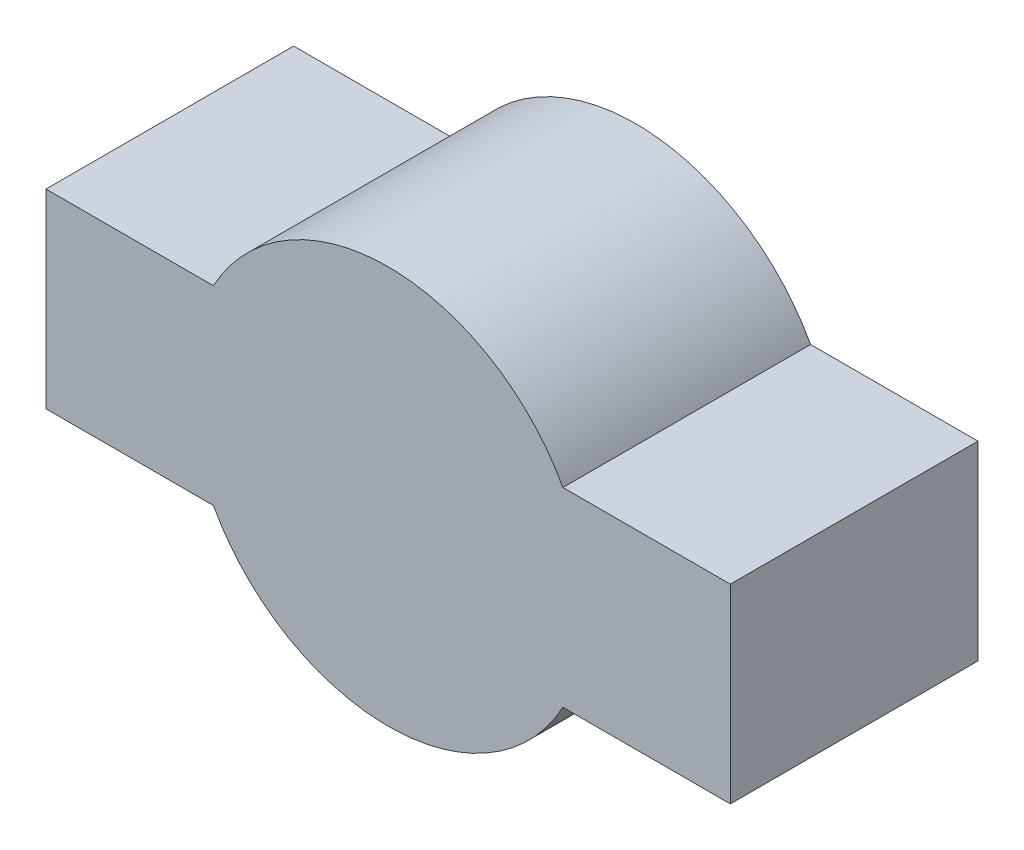
ISO-10303-21;
HEADER;
FILE_DESCRIPTION(('STEP AP214'),'2;1');
FILE_NAME('part.step','',(''),(''),'','','');
FILE_SCHEMA(('AUTOMOTIVE_DESIGN { 1 0 10303 214 1 1 1 1 }'));
ENDSEC;
DATA;
#1=APPLICATION_CONTEXT('core data for automotive mechanical design processes');
#2=APPLICATION_PROTOCOL_DEFINITION('international standard','automotive_design',2000,#1);
#3=PRODUCT_CONTEXT('',#1,'mechanical');
#4=PRODUCT('Part','Part','',(#3));
#5=PRODUCT_RELATED_PRODUCT_CATEGORY('part','',(#4));
#6=PRODUCT_DEFINITION_FORMATION('','',#4);
#7=PRODUCT_DEFINITION_CONTEXT('part definition',#1,'design');
#8=PRODUCT_DEFINITION('design','',#6,#7);
#9=PRODUCT_DEFINITION_SHAPE('','',#8);
#10=(LENGTH_UNIT() NAMED_UNIT(*) SI_UNIT(.MILLI.,.METRE.));
#11=(NAMED_UNIT(*) PLANE_ANGLE_UNIT() SI_UNIT($,.RADIAN.));
#12=(NAMED_UNIT(*) SI_UNIT($,.STERADIAN.) SOLID_ANGLE_UNIT());
#13=UNCERTAINTY_MEASURE_WITH_UNIT(LENGTH_MEASURE(1.E-05),#10,'distance_accuracy_value','');
#14=(GEOMETRIC_REPRESENTATION_CONTEXT(3) GLOBAL_UNCERTAINTY_ASSIGNED_CONTEXT((#13)) GLOBAL_UNIT_ASSIGNED_CONTEXT((#10,
#11,#12)) REPRESENTATION_CONTEXT('',''));
#15=CARTESIAN_POINT('',(0.,0.,0.));
#16=DIRECTION('',(0.,0.,1.));
#17=DIRECTION('',(1.,0.,0.));
#18=AXIS2_PLACEMENT_3D('',#15,#16,#17);
#19=CARTESIAN_POINT('',(-138.154297706632,-38.4270232031692,100.));
#20=DIRECTION('',(-1.,0.,0.));
#21=DIRECTION('',(0.,0.,1.));
#22=AXIS2_PLACEMENT_3D('',#19,#20,#21);
#23=PLANE('',#22);
#24=DIRECTION('',(0.,1.,0.));
#25=VECTOR('',#24,1.);
#26=CARTESIAN_POINT('',(-138.154297706632,-38.4270232031692,0.));
#27=LINE('',#26,#25);
#28=CARTESIAN_POINT('',(-138.154297706632,-38.4270232031692,0.));
#29=VERTEX_POINT('',#28);
#30=CARTESIAN_POINT('',(-138.154297706632,38.4270232031692,0.));
#31=VERTEX_POINT('',#30);
#32=EDGE_CURVE('E151',#29,#31,#27,.T.);
#33=ORIENTED_EDGE('',*,*,#32,.F.);
#34=DIRECTION('',(0.,0.,-1.));
#35=VECTOR('',#34,1.);
#36=CARTESIAN_POINT('',(-138.154297706632,-38.4270232031692,100.));
#37=LINE('',#36,#35);
#38=CARTESIAN_POINT('',(-138.154297706632,-38.4270232031692,100.));
#39=VERTEX_POINT('',#38);
#40=EDGE_CURVE('E139',#39,#29,#37,.T.);
#41=ORIENTED_EDGE('',*,*,#40,.F.);
#42=DIRECTION('',(0.,1.,0.));
#43=VECTOR('',#42,1.);
#44=CARTESIAN_POINT('',(-138.154297706632,-38.4270232031692,100.));
#45=LINE('',#44,#43);
#46=CARTESIAN_POINT('',(-138.154297706632,38.4270232031692,100.));
#47=VERTEX_POINT('',#46);
#48=EDGE_CURVE('E133',#39,#47,#45,.T.);
#49=ORIENTED_EDGE('',*,*,#48,.T.);
#50=DIRECTION('',(0.,0.,-1.));
#51=VECTOR('',#50,1.);
#52=CARTESIAN_POINT('',(-138.154297706632,38.4270232031692,100.));
#53=LINE('',#52,#51);
#54=EDGE_CURVE('E116',#47,#31,#53,.T.);
#55=ORIENTED_EDGE('',*,*,#54,.T.);
#56=EDGE_LOOP('',(#33,#41,#49,#55));
#57=FACE_BOUND('',#56,.T.);
#58=ADVANCED_FACE('F52',(#57),#23,.T.);
#59=CARTESIAN_POINT('',(-138.154297706632,-38.4270232031692,100.));
#60=DIRECTION('',(0.,1.,0.));
#61=DIRECTION('',(0.,0.,1.));
#62=AXIS2_PLACEMENT_3D('',#59,#60,#61);
#63=PLANE('',#62);
#64=DIRECTION('',(0.,0.,-1.));
#65=VECTOR('',#64,1.);
#66=CARTESIAN_POINT('',(-70.5634225849753,-38.4270232031692,100.));
#67=LINE('',#66,#65);
#68=CARTESIAN_POINT('',(-70.5634225849753,-38.4270232031692,100.));
#69=VERTEX_POINT('',#68);
#70=CARTESIAN_POINT('',(-70.5634225849753,-38.4270232031692,0.));
#71=VERTEX_POINT('',#70);
#72=EDGE_CURVE('E60',#69,#71,#67,.T.);
#73=ORIENTED_EDGE('',*,*,#72,.F.);
#74=DIRECTION('',(1.,0.,0.));
#75=VECTOR('',#74,1.);
#76=CARTESIAN_POINT('',(-138.154297706632,-38.4270232031692,100.));
#77=LINE('',#76,#75);
#78=EDGE_CURVE('E127',#39,#69,#77,.T.);
#79=ORIENTED_EDGE('',*,*,#78,.F.);
#80=ORIENTED_EDGE('',*,*,#40,.T.);
#81=DIRECTION('',(1.,0.,0.));
#82=VECTOR('',#81,1.);
#83=CARTESIAN_POINT('',(-138.154297706632,-38.4270232031692,0.));
#84=LINE('',#83,#82);
#85=EDGE_CURVE('E141',#29,#71,#84,.T.);
#86=ORIENTED_EDGE('',*,*,#85,.T.);
#87=EDGE_LOOP('',(#73,#79,#80,#86));
#88=FACE_BOUND('',#87,.T.);
#89=ADVANCED_FACE('F182',(#88),#63,.F.);
#90=CARTESIAN_POINT('',(-138.154297706632,38.4270232031692,100.));
#91=DIRECTION('',(0.,1.,0.));
#92=DIRECTION('',(0.,0.,1.));
#93=AXIS2_PLACEMENT_3D('',#90,#91,#92);
#94=PLANE('',#93);
#95=DIRECTION('',(1.,0.,0.));
#96=VECTOR('',#95,1.);
#97=CARTESIAN_POINT('',(-138.154297706632,38.4270232031692,100.));
#98=LINE('',#97,#96);
#99=CARTESIAN_POINT('',(-70.5634225849753,38.4270232031692,100.));
#100=VERTEX_POINT('',#99);
#101=EDGE_CURVE('E119',#47,#100,#98,.T.);
#102=ORIENTED_EDGE('',*,*,#101,.T.);
#103=DIRECTION('',(0.,0.,-1.));
#104=VECTOR('',#103,1.);
#105=CARTESIAN_POINT('',(-70.5634225849753,38.4270232031692,100.));
#106=LINE('',#105,#104);
#107=CARTESIAN_POINT('',(-70.5634225849753,38.4270232031692,0.));
#108=VERTEX_POINT('',#107);
#109=EDGE_CURVE('E74',#100,#108,#106,.T.);
#110=ORIENTED_EDGE('',*,*,#109,.T.);
#111=DIRECTION('',(1.,0.,0.));
#112=VECTOR('',#111,1.);
#113=CARTESIAN_POINT('',(-138.154297706632,38.4270232031692,0.));
#114=LINE('',#113,#112);
#115=EDGE_CURVE('E121',#31,#108,#114,.T.);
#116=ORIENTED_EDGE('',*,*,#115,.F.);
#117=ORIENTED_EDGE('',*,*,#54,.F.);
#118=EDGE_LOOP('',(#102,#110,#116,#117));
#119=FACE_BOUND('',#118,.T.);
#120=ADVANCED_FACE('F118',(#119),#94,.T.);
#121=CARTESIAN_POINT('',(0.,0.,0.));
#122=DIRECTION('',(0.,0.,-1.));
#123=DIRECTION('',(-1.,0.,0.));
#124=AXIS2_PLACEMENT_3D('',#121,#122,#123);
#125=PLANE('',#124);
#126=ORIENTED_EDGE('',*,*,#115,.T.);
#127=CARTESIAN_POINT('',(0.,0.,0.));
#128=DIRECTION('',(0.,0.,1.));
#129=DIRECTION('',(1.,0.,0.));
#130=AXIS2_PLACEMENT_3D('',#127,#128,#129);
#131=CIRCLE('',#130,80.3481967387116);
#132=CARTESIAN_POINT('',(70.5634225849753,38.4270232031692,0.));
#133=VERTEX_POINT('',#132);
#134=EDGE_CURVE('E166',#133,#108,#131,.T.);
#135=ORIENTED_EDGE('',*,*,#134,.F.);
#136=CARTESIAN_POINT('',(138.154297706632,38.4270232031692,0.));
#137=VERTEX_POINT('',#136);
#138=EDGE_CURVE('E153',#133,#137,#114,.T.);
#139=ORIENTED_EDGE('',*,*,#138,.T.);
#140=DIRECTION('',(0.,1.,0.));
#141=VECTOR('',#140,1.);
#142=CARTESIAN_POINT('',(138.154297706632,-38.4270232031692,0.));
#143=LINE('',#142,#141);
#144=CARTESIAN_POINT('',(138.154297706632,-38.4270232031692,0.));
#145=VERTEX_POINT('',#144);
#146=EDGE_CURVE('E155',#145,#137,#143,.T.);
#147=ORIENTED_EDGE('',*,*,#146,.F.);
#148=CARTESIAN_POINT('',(70.5634225849753,-38.4270232031692,0.));
#149=VERTEX_POINT('',#148);
#150=EDGE_CURVE('E144',#149,#145,#84,.T.);
#151=ORIENTED_EDGE('',*,*,#150,.F.);
#152=EDGE_CURVE('E168',#71,#149,#131,.T.);
#153=ORIENTED_EDGE('',*,*,#152,.F.);
#154=ORIENTED_EDGE('',*,*,#85,.F.);
#155=ORIENTED_EDGE('',*,*,#32,.T.);
#156=EDGE_LOOP('',(#126,#135,#139,#147,#151,#153,#154,#155));
#157=FACE_BOUND('',#156,.T.);
#158=ADVANCED_FACE('F180',(#157),#125,.T.);
#159=CARTESIAN_POINT('',(0.,0.,100.));
#160=DIRECTION('',(0.,0.,-1.));
#161=DIRECTION('',(-1.,0.,0.));
#162=AXIS2_PLACEMENT_3D('',#159,#160,#161);
#163=PLANE('',#162);
#164=ORIENTED_EDGE('',*,*,#78,.T.);
#165=CARTESIAN_POINT('',(0.,0.,100.));
#166=DIRECTION('',(0.,0.,1.));
#167=DIRECTION('',(1.,0.,0.));
#168=AXIS2_PLACEMENT_3D('',#165,#166,#167);
#169=CIRCLE('',#168,80.3481967387116);
#170=CARTESIAN_POINT('',(70.5634225849753,-38.4270232031692,100.));
#171=VERTEX_POINT('',#170);
#172=EDGE_CURVE('E165',#69,#171,#169,.T.);
#173=ORIENTED_EDGE('',*,*,#172,.T.);
#174=CARTESIAN_POINT('',(138.154297706632,-38.4270232031692,100.));
#175=VERTEX_POINT('',#174);
#176=EDGE_CURVE('E149',#171,#175,#77,.T.);
#177=ORIENTED_EDGE('',*,*,#176,.T.);
#178=DIRECTION('',(0.,1.,0.));
#179=VECTOR('',#178,1.);
#180=CARTESIAN_POINT('',(138.154297706632,-38.4270232031692,100.));
#181=LINE('',#180,#179);
#182=CARTESIAN_POINT('',(138.154297706632,38.4270232031692,100.));
#183=VERTEX_POINT('',#182);
#184=EDGE_CURVE('E136',#175,#183,#181,.T.);
#185=ORIENTED_EDGE('',*,*,#184,.T.);
#186=CARTESIAN_POINT('',(70.5634225849753,38.4270232031692,100.));
#187=VERTEX_POINT('',#186);
#188=EDGE_CURVE('E137',#187,#183,#98,.T.);
#189=ORIENTED_EDGE('',*,*,#188,.F.);
#190=EDGE_CURVE('E135',#187,#100,#169,.T.);
#191=ORIENTED_EDGE('',*,*,#190,.T.);
#192=ORIENTED_EDGE('',*,*,#101,.F.);
#193=ORIENTED_EDGE('',*,*,#48,.F.);
#194=EDGE_LOOP('',(#164,#173,#177,#185,#189,#191,#192,#193));
#195=FACE_BOUND('',#194,.T.);
#196=ADVANCED_FACE('F132',(#195),#163,.F.);
#197=CARTESIAN_POINT('',(138.154297706632,-38.4270232031692,100.));
#198=DIRECTION('',(-1.,0.,0.));
#199=DIRECTION('',(0.,0.,1.));
#200=AXIS2_PLACEMENT_3D('',#197,#198,#199);
#201=PLANE('',#200);
#202=ORIENTED_EDGE('',*,*,#146,.T.);
#203=DIRECTION('',(0.,0.,-1.));
#204=VECTOR('',#203,1.);
#205=CARTESIAN_POINT('',(138.154297706632,38.4270232031692,100.));
#206=LINE('',#205,#204);
#207=EDGE_CURVE('E126',#183,#137,#206,.T.);
#208=ORIENTED_EDGE('',*,*,#207,.F.);
#209=ORIENTED_EDGE('',*,*,#184,.F.);
#210=DIRECTION('',(0.,0.,-1.));
#211=VECTOR('',#210,1.);
#212=CARTESIAN_POINT('',(138.154297706632,-38.4270232031692,100.));
#213=LINE('',#212,#211);
#214=EDGE_CURVE('E159',#175,#145,#213,.T.);
#215=ORIENTED_EDGE('',*,*,#214,.T.);
#216=EDGE_LOOP('',(#202,#208,#209,#215));
#217=FACE_BOUND('',#216,.T.);
#218=ADVANCED_FACE('F190',(#217),#201,.F.);
#219=ORIENTED_EDGE('',*,*,#138,.F.);
#220=DIRECTION('',(0.,0.,-1.));
#221=VECTOR('',#220,1.);
#222=CARTESIAN_POINT('',(70.5634225849753,38.4270232031692,100.));
#223=LINE('',#222,#221);
#224=EDGE_CURVE('E67',#133,#187,#223,.F.);
#225=ORIENTED_EDGE('',*,*,#224,.T.);
#226=ORIENTED_EDGE('',*,*,#188,.T.);
#227=ORIENTED_EDGE('',*,*,#207,.T.);
#228=EDGE_LOOP('',(#219,#225,#226,#227));
#229=FACE_BOUND('',#228,.T.);
#230=ADVANCED_FACE('F191',(#229),#94,.T.);
#231=DIRECTION('',(0.,0.,-1.));
#232=VECTOR('',#231,1.);
#233=CARTESIAN_POINT('',(70.5634225849753,-38.4270232031692,100.));
#234=LINE('',#233,#232);
#235=EDGE_CURVE('E12',#149,#171,#234,.F.);
#236=ORIENTED_EDGE('',*,*,#235,.F.);
#237=ORIENTED_EDGE('',*,*,#150,.T.);
#238=ORIENTED_EDGE('',*,*,#214,.F.);
#239=ORIENTED_EDGE('',*,*,#176,.F.);
#240=EDGE_LOOP('',(#236,#237,#238,#239));
#241=FACE_BOUND('',#240,.T.);
#242=ADVANCED_FACE('F186',(#241),#63,.F.);
#243=CARTESIAN_POINT('',(0.,0.,100.));
#244=DIRECTION('',(0.,0.,-1.));
#245=DIRECTION('',(-1.,0.,0.));
#246=AXIS2_PLACEMENT_3D('',#243,#244,#245);
#247=CYLINDRICAL_SURFACE('',#246,80.3481967387116);
#248=ORIENTED_EDGE('',*,*,#224,.F.);
#249=ORIENTED_EDGE('',*,*,#134,.T.);
#250=ORIENTED_EDGE('',*,*,#109,.F.);
#251=ORIENTED_EDGE('',*,*,#190,.F.);
#252=EDGE_LOOP('',(#248,#249,#250,#251));
#253=FACE_BOUND('',#252,.T.);
#254=ADVANCED_FACE('F54',(#253),#247,.T.);
#255=ORIENTED_EDGE('',*,*,#152,.T.);
#256=ORIENTED_EDGE('',*,*,#235,.T.);
#257=ORIENTED_EDGE('',*,*,#172,.F.);
#258=ORIENTED_EDGE('',*,*,#72,.T.);
#259=EDGE_LOOP('',(#255,#256,#257,#258));
#260=FACE_BOUND('',#259,.T.);
#261=ADVANCED_FACE('F174',(#260),#247,.T.);
#262=CLOSED_SHELL('',(#58,#89,#120,#158,#196,#218,#230,#242,#254,#261));
#263=MANIFOLD_SOLID_BREP('B2',#262);
#264=ADVANCED_BREP_SHAPE_REPRESENTATION('',(#18,#263),#14);
#265=SHAPE_DEFINITION_REPRESENTATION(#9,#264);
ENDSEC;
END-ISO-10303-21;
